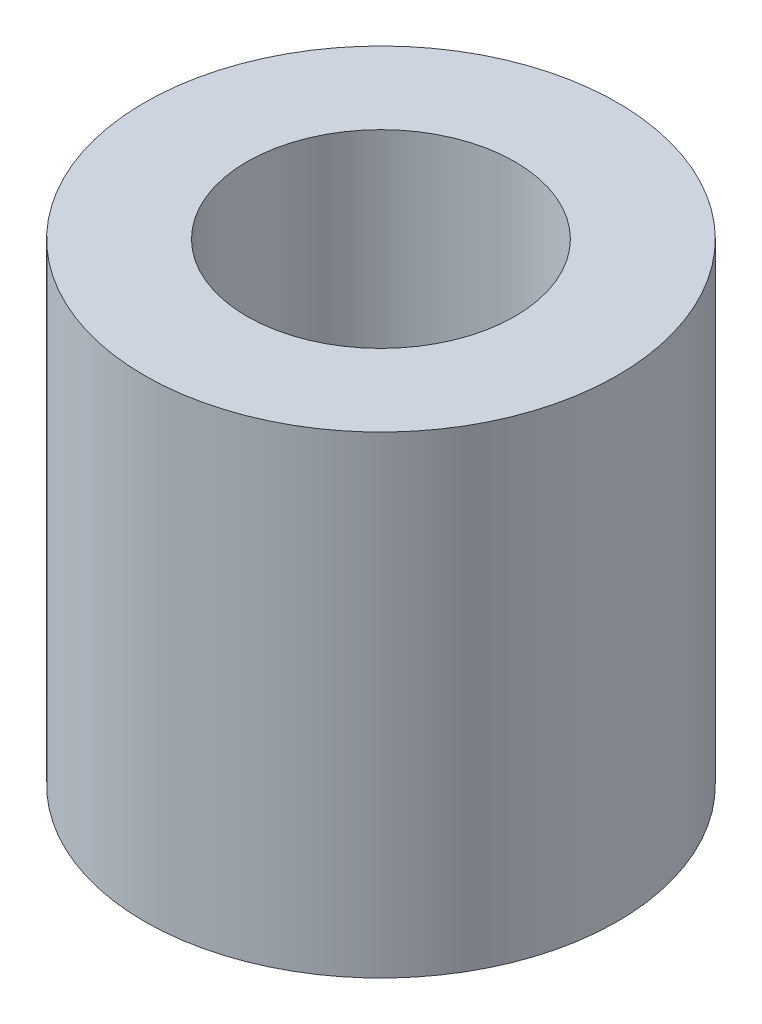
ISO-10303-21;
HEADER;
FILE_DESCRIPTION(('STEP AP214'),'2;1');
FILE_NAME('part.step','',(''),(''),'','','');
FILE_SCHEMA(('AUTOMOTIVE_DESIGN { 1 0 10303 214 1 1 1 1 }'));
ENDSEC;
DATA;
#1=APPLICATION_CONTEXT('core data for automotive mechanical design processes');
#2=APPLICATION_PROTOCOL_DEFINITION('international standard','automotive_design',2000,#1);
#3=PRODUCT_CONTEXT('',#1,'mechanical');
#4=PRODUCT('Part','Part','',(#3));
#5=PRODUCT_RELATED_PRODUCT_CATEGORY('part','',(#4));
#6=PRODUCT_DEFINITION_FORMATION('','',#4);
#7=PRODUCT_DEFINITION_CONTEXT('part definition',#1,'design');
#8=PRODUCT_DEFINITION('design','',#6,#7);
#9=PRODUCT_DEFINITION_SHAPE('','',#8);
#10=(LENGTH_UNIT() NAMED_UNIT(*) SI_UNIT(.MILLI.,.METRE.));
#11=(NAMED_UNIT(*) PLANE_ANGLE_UNIT() SI_UNIT($,.RADIAN.));
#12=(NAMED_UNIT(*) SI_UNIT($,.STERADIAN.) SOLID_ANGLE_UNIT());
#13=UNCERTAINTY_MEASURE_WITH_UNIT(LENGTH_MEASURE(1.E-05),#10,'distance_accuracy_value','');
#14=(GEOMETRIC_REPRESENTATION_CONTEXT(3) GLOBAL_UNCERTAINTY_ASSIGNED_CONTEXT((#13)) GLOBAL_UNIT_ASSIGNED_CONTEXT((#10,
#11,#12)) REPRESENTATION_CONTEXT('',''));
#15=CARTESIAN_POINT('',(0.,0.,0.));
#16=DIRECTION('',(0.,0.,1.));
#17=DIRECTION('',(1.,0.,0.));
#18=AXIS2_PLACEMENT_3D('',#15,#16,#17);
#19=CARTESIAN_POINT('',(0.,6.,0.));
#20=DIRECTION('',(0.,-1.,0.));
#21=DIRECTION('',(0.,0.,-1.));
#22=AXIS2_PLACEMENT_3D('',#19,#20,#21);
#23=CYLINDRICAL_SURFACE('',#22,3.);
#24=CARTESIAN_POINT('',(0.,6.,0.));
#25=DIRECTION('',(0.,1.,0.));
#26=DIRECTION('',(0.,0.,1.));
#27=AXIS2_PLACEMENT_3D('',#24,#25,#26);
#28=CIRCLE('',#27,3.);
#29=CARTESIAN_POINT('',(0.,6.,3.));
#30=VERTEX_POINT('',#29);
#31=EDGE_CURVE('E10',#30,#30,#28,.T.);
#32=ORIENTED_EDGE('',*,*,#31,.F.);
#33=EDGE_LOOP('',(#32));
#34=FACE_BOUND('',#33,.T.);
#35=CARTESIAN_POINT('',(0.,0.,0.));
#36=DIRECTION('',(0.,1.,0.));
#37=DIRECTION('',(0.,0.,1.));
#38=AXIS2_PLACEMENT_3D('',#35,#36,#37);
#39=CIRCLE('',#38,3.);
#40=CARTESIAN_POINT('',(0.,0.,3.));
#41=VERTEX_POINT('',#40);
#42=EDGE_CURVE('E34',#41,#41,#39,.T.);
#43=ORIENTED_EDGE('',*,*,#42,.T.);
#44=EDGE_LOOP('',(#43));
#45=FACE_BOUND('',#44,.T.);
#46=ADVANCED_FACE('F31',(#34,#45),#23,.T.);
#47=CARTESIAN_POINT('',(0.,6.,0.));
#48=DIRECTION('',(0.,1.,0.));
#49=DIRECTION('',(0.,0.,1.));
#50=AXIS2_PLACEMENT_3D('',#47,#48,#49);
#51=PLANE('',#50);
#52=CARTESIAN_POINT('',(0.,6.,0.));
#53=DIRECTION('',(0.,1.,0.));
#54=DIRECTION('',(0.,0.,1.));
#55=AXIS2_PLACEMENT_3D('',#52,#53,#54);
#56=CIRCLE('',#55,1.69999999999999);
#57=CARTESIAN_POINT('',(0.,6.,1.69999999999999));
#58=VERTEX_POINT('',#57);
#59=EDGE_CURVE('E45',#58,#58,#56,.T.);
#60=ORIENTED_EDGE('',*,*,#59,.F.);
#61=EDGE_LOOP('',(#60));
#62=FACE_BOUND('',#61,.T.);
#63=ORIENTED_EDGE('',*,*,#31,.T.);
#64=EDGE_LOOP('',(#63));
#65=FACE_BOUND('',#64,.T.);
#66=ADVANCED_FACE('F51',(#62,#65),#51,.T.);
#67=CARTESIAN_POINT('',(0.,0.,0.));
#68=DIRECTION('',(0.,1.,0.));
#69=DIRECTION('',(0.,0.,1.));
#70=AXIS2_PLACEMENT_3D('',#67,#68,#69);
#71=PLANE('',#70);
#72=CARTESIAN_POINT('',(0.,0.,0.));
#73=DIRECTION('',(0.,1.,0.));
#74=DIRECTION('',(0.,0.,1.));
#75=AXIS2_PLACEMENT_3D('',#72,#73,#74);
#76=CIRCLE('',#75,1.7);
#77=CARTESIAN_POINT('',(0.,0.,1.7));
#78=VERTEX_POINT('',#77);
#79=EDGE_CURVE('E41',#78,#78,#76,.T.);
#80=ORIENTED_EDGE('',*,*,#79,.T.);
#81=EDGE_LOOP('',(#80));
#82=FACE_BOUND('',#81,.T.);
#83=ORIENTED_EDGE('',*,*,#42,.F.);
#84=EDGE_LOOP('',(#83));
#85=FACE_BOUND('',#84,.T.);
#86=ADVANCED_FACE('F53',(#82,#85),#71,.F.);
#87=CARTESIAN_POINT('',(0.,6.,0.));
#88=DIRECTION('',(0.,1.,0.));
#89=DIRECTION('',(0.,0.,1.));
#90=AXIS2_PLACEMENT_3D('',#87,#88,#89);
#91=CYLINDRICAL_SURFACE('',#90,1.69999999999999);
#92=ORIENTED_EDGE('',*,*,#79,.F.);
#93=EDGE_LOOP('',(#92));
#94=FACE_BOUND('',#93,.T.);
#95=ORIENTED_EDGE('',*,*,#59,.T.);
#96=EDGE_LOOP('',(#95));
#97=FACE_BOUND('',#96,.T.);
#98=ADVANCED_FACE('F49',(#94,#97),#91,.F.);
#99=CLOSED_SHELL('',(#46,#66,#86,#98));
#100=MANIFOLD_SOLID_BREP('B2',#99);
#101=ADVANCED_BREP_SHAPE_REPRESENTATION('',(#18,#100),#14);
#102=SHAPE_DEFINITION_REPRESENTATION(#9,#101);
ENDSEC;
END-ISO-10303-21;
